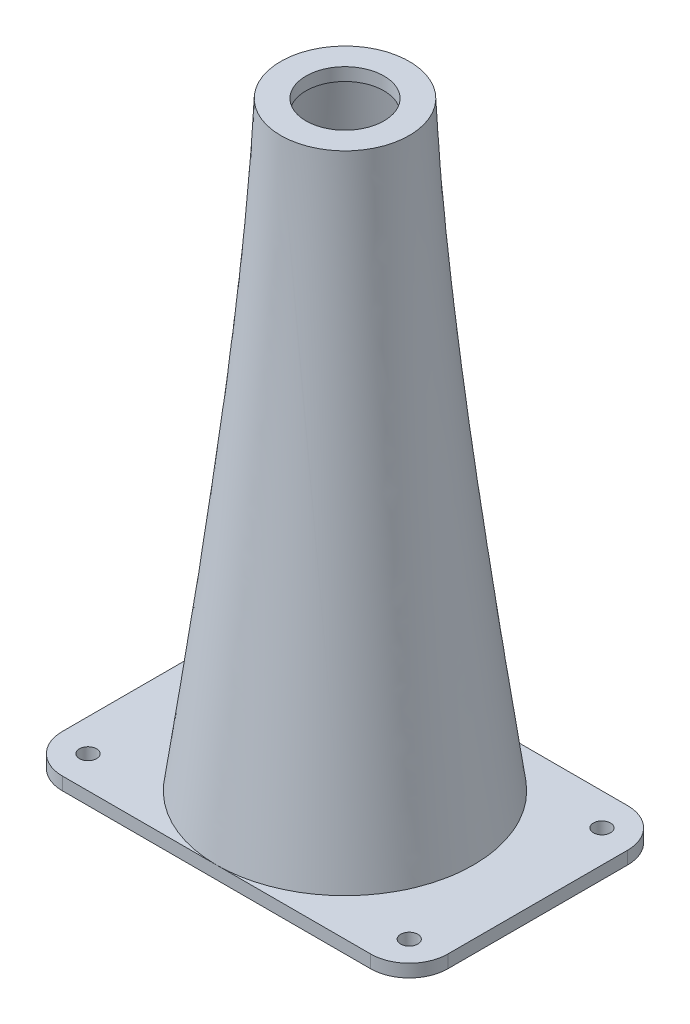
ISO-10303-21;
HEADER;
FILE_DESCRIPTION(('STEP AP214'),'2;1');
FILE_NAME('part.step','',(''),(''),'','','');
FILE_SCHEMA(('AUTOMOTIVE_DESIGN { 1 0 10303 214 1 1 1 1 }'));
ENDSEC;
DATA;
#1=APPLICATION_CONTEXT('core data for automotive mechanical design processes');
#2=APPLICATION_PROTOCOL_DEFINITION('international standard','automotive_design',2000,#1);
#3=PRODUCT_CONTEXT('',#1,'mechanical');
#4=PRODUCT('Part','Part','',(#3));
#5=PRODUCT_RELATED_PRODUCT_CATEGORY('part','',(#4));
#6=PRODUCT_DEFINITION_FORMATION('','',#4);
#7=PRODUCT_DEFINITION_CONTEXT('part definition',#1,'design');
#8=PRODUCT_DEFINITION('design','',#6,#7);
#9=PRODUCT_DEFINITION_SHAPE('','',#8);
#10=(LENGTH_UNIT() NAMED_UNIT(*) SI_UNIT(.MILLI.,.METRE.));
#11=(NAMED_UNIT(*) PLANE_ANGLE_UNIT() SI_UNIT($,.RADIAN.));
#12=(NAMED_UNIT(*) SI_UNIT($,.STERADIAN.) SOLID_ANGLE_UNIT());
#13=UNCERTAINTY_MEASURE_WITH_UNIT(LENGTH_MEASURE(1.E-05),#10,'distance_accuracy_value','');
#14=(GEOMETRIC_REPRESENTATION_CONTEXT(3) GLOBAL_UNCERTAINTY_ASSIGNED_CONTEXT((#13)) GLOBAL_UNIT_ASSIGNED_CONTEXT((#10,
#11,#12)) REPRESENTATION_CONTEXT('',''));
#15=CARTESIAN_POINT('',(0.,0.,0.));
#16=DIRECTION('',(0.,0.,1.));
#17=DIRECTION('',(1.,0.,0.));
#18=AXIS2_PLACEMENT_3D('',#15,#16,#17);
#19=CARTESIAN_POINT('',(0.,0.,0.));
#20=DIRECTION('',(0.,-1.,0.));
#21=DIRECTION('',(0.,0.,-1.));
#22=AXIS2_PLACEMENT_3D('',#19,#20,#21);
#23=CONICAL_SURFACE('',#22,27.5,0.10471975511966);
#24=CARTESIAN_POINT('',(0.,0.,0.));
#25=DIRECTION('',(0.,-1.,0.));
#26=DIRECTION('',(0.,0.,-1.));
#27=AXIS2_PLACEMENT_3D('',#24,#25,#26);
#28=CIRCLE('',#27,27.5);
#29=CARTESIAN_POINT('',(0.,0.,-27.5));
#30=VERTEX_POINT('',#29);
#31=EDGE_CURVE('E120',#30,#30,#28,.F.);
#32=ORIENTED_EDGE('',*,*,#31,.F.);
#33=EDGE_LOOP('',(#32));
#34=FACE_BOUND('',#33,.T.);
#35=CARTESIAN_POINT('',(0.,137.,0.));
#36=DIRECTION('',(0.,1.,0.));
#37=DIRECTION('',(0.,0.,1.));
#38=AXIS2_PLACEMENT_3D('',#35,#36,#37);
#39=CIRCLE('',#38,13.1007197686023);
#40=CARTESIAN_POINT('',(0.,137.,13.1007197686023));
#41=VERTEX_POINT('',#40);
#42=EDGE_CURVE('E141',#41,#41,#39,.F.);
#43=ORIENTED_EDGE('',*,*,#42,.F.);
#44=EDGE_LOOP('',(#43));
#45=FACE_BOUND('',#44,.T.);
#46=ADVANCED_FACE('F41',(#34,#45),#23,.F.);
#47=CARTESIAN_POINT('',(0.,140.,0.));
#48=DIRECTION('',(0.,1.,0.));
#49=DIRECTION('',(0.,0.,1.));
#50=AXIS2_PLACEMENT_3D('',#47,#48,#49);
#51=PLANE('',#50);
#52=CARTESIAN_POINT('',(0.,140.,0.));
#53=DIRECTION('',(0.,1.,0.));
#54=DIRECTION('',(0.,0.,1.));
#55=AXIS2_PLACEMENT_3D('',#52,#53,#54);
#56=CIRCLE('',#55,15.);
#57=CARTESIAN_POINT('',(0.,140.,15.));
#58=VERTEX_POINT('',#57);
#59=EDGE_CURVE('E131',#58,#58,#56,.T.);
#60=ORIENTED_EDGE('',*,*,#59,.T.);
#61=EDGE_LOOP('',(#60));
#62=FACE_BOUND('',#61,.T.);
#63=CARTESIAN_POINT('',(0.,140.,0.));
#64=DIRECTION('',(0.,1.,0.));
#65=DIRECTION('',(0.,0.,1.));
#66=AXIS2_PLACEMENT_3D('',#63,#64,#65);
#67=CIRCLE('',#66,9.1);
#68=CARTESIAN_POINT('',(0.,140.,9.1));
#69=VERTEX_POINT('',#68);
#70=EDGE_CURVE('E155',#69,#69,#67,.T.);
#71=ORIENTED_EDGE('',*,*,#70,.F.);
#72=EDGE_LOOP('',(#71));
#73=FACE_BOUND('',#72,.T.);
#74=ADVANCED_FACE('F240',(#62,#73),#51,.T.);
#75=CARTESIAN_POINT('',(10.752198870761,140.,10.4589779349422));
#76=CARTESIAN_POINT('',(29.9923257228319,0.,-0.678526149501881));
#77=CARTESIAN_POINT('',(-10.1657569991234,140.,31.9633756764641));
#78=CARTESIAN_POINT('',(31.3493780218356,0.,59.3061252961618));
#79=CARTESIAN_POINT('',(-31.6701547406453,140.,11.0454198065797));
#80=CARTESIAN_POINT('',(-28.6352734238281,0.,60.6631775951656));
#81=CARTESIAN_POINT('',(-10.7521988707609,140.,-10.4589779349422));
#82=CARTESIAN_POINT('',(-29.9923257228319,0.,0.678526149501877));
#83=CARTESIAN_POINT('',(10.1657569991234,140.,-31.9633756764641));
#84=CARTESIAN_POINT('',(-31.3493780218356,0.,-59.3061252961619));
#85=CARTESIAN_POINT('',(31.6701547406453,140.,-11.0454198065797));
#86=CARTESIAN_POINT('',(28.6352734238281,0.,-60.6631775951656));
#87=CARTESIAN_POINT('',(10.752198870761,140.,10.4589779349422));
#88=CARTESIAN_POINT('',(29.9923257228319,0.,-0.678526149501881));
#89=(BOUNDED_SURFACE() B_SPLINE_SURFACE(3,1,((#75,#76),(#77,#78),(#79,#80),(#81,#82),(#83,#84),
(#85,#86),(#87,#88)),.UNSPECIFIED.,.T.,.F.,.F.) B_SPLINE_SURFACE_WITH_KNOTS((4,3,4),(2,2),(0.,
0.5,1.),(0.,1.),.UNSPECIFIED.) GEOMETRIC_REPRESENTATION_ITEM() RATIONAL_B_SPLINE_SURFACE(((1.,
1.),(0.333333333333333,0.333333333333333),(0.333333333333333,0.333333333333333),(1.,1.),
(0.333333333333333,0.333333333333333),(0.333333333333333,0.333333333333333),(1.,1.))) REPRESENTATION_ITEM('') SURFACE());
#90=CARTESIAN_POINT('',(0.,0.,0.));
#91=DIRECTION('',(0.,1.,0.));
#92=DIRECTION('',(0.,0.,1.));
#93=AXIS2_PLACEMENT_3D('',#90,#91,#92);
#94=CIRCLE('',#93,30.);
#95=CARTESIAN_POINT('',(0.000549099686862685,0.,-30.0000000000041));
#96=VERTEX_POINT('',#95);
#97=CARTESIAN_POINT('',(0.,0.,30.));
#98=VERTEX_POINT('',#97);
#99=EDGE_CURVE('E116',#96,#98,#94,.T.);
#100=EDGE_CURVE('E126',#98,#96,#94,.T.);
#101=ORIENTED_EDGE('',*,*,#59,.F.);
#102=EDGE_LOOP('',(#101));
#103=FACE_BOUND('',#102,.T.);
#104=ORIENTED_EDGE('',*,*,#99,.T.);
#105=ORIENTED_EDGE('',*,*,#100,.T.);
#106=EDGE_LOOP('',(#104,#105));
#107=FACE_BOUND('',#106,.T.);
#108=ADVANCED_FACE('F140',(#103,#107),#89,.T.);
#109=CARTESIAN_POINT('',(0.,137.,0.));
#110=DIRECTION('',(0.,1.,0.));
#111=DIRECTION('',(0.,0.,1.));
#112=AXIS2_PLACEMENT_3D('',#109,#110,#111);
#113=PLANE('',#112);
#114=CARTESIAN_POINT('',(0.,137.,0.));
#115=DIRECTION('',(0.,1.,0.));
#116=DIRECTION('',(0.,0.,1.));
#117=AXIS2_PLACEMENT_3D('',#114,#115,#116);
#118=CIRCLE('',#117,9.1);
#119=CARTESIAN_POINT('',(0.,137.,9.1));
#120=VERTEX_POINT('',#119);
#121=EDGE_CURVE('E154',#120,#120,#118,.T.);
#122=ORIENTED_EDGE('',*,*,#121,.T.);
#123=EDGE_LOOP('',(#122));
#124=FACE_BOUND('',#123,.T.);
#125=ORIENTED_EDGE('',*,*,#42,.T.);
#126=EDGE_LOOP('',(#125));
#127=FACE_BOUND('',#126,.T.);
#128=ADVANCED_FACE('F252',(#124,#127),#113,.F.);
#129=CARTESIAN_POINT('',(0.,137.,0.));
#130=DIRECTION('',(0.,1.,0.));
#131=DIRECTION('',(0.,0.,1.));
#132=AXIS2_PLACEMENT_3D('',#129,#130,#131);
#133=CYLINDRICAL_SURFACE('',#132,9.1);
#134=ORIENTED_EDGE('',*,*,#121,.F.);
#135=EDGE_LOOP('',(#134));
#136=FACE_BOUND('',#135,.T.);
#137=ORIENTED_EDGE('',*,*,#70,.T.);
#138=EDGE_LOOP('',(#137));
#139=FACE_BOUND('',#138,.T.);
#140=ADVANCED_FACE('F269',(#136,#139),#133,.F.);
#141=CARTESIAN_POINT('',(0.,0.,0.));
#142=DIRECTION('',(0.,-1.,0.));
#143=DIRECTION('',(0.,0.,-1.));
#144=AXIS2_PLACEMENT_3D('',#141,#142,#143);
#145=PLANE('',#144);
#146=CARTESIAN_POINT('',(-37.5,0.,22.5));
#147=DIRECTION('',(0.,-1.,0.));
#148=DIRECTION('',(0.,0.,-1.));
#149=AXIS2_PLACEMENT_3D('',#146,#147,#148);
#150=CIRCLE('',#149,2.);
#151=CARTESIAN_POINT('',(-37.5,0.,20.5));
#152=VERTEX_POINT('',#151);
#153=EDGE_CURVE('E478',#152,#152,#150,.F.);
#154=ORIENTED_EDGE('',*,*,#153,.F.);
#155=EDGE_LOOP('',(#154));
#156=FACE_BOUND('',#155,.T.);
#157=CARTESIAN_POINT('',(-37.5,0.,-22.5));
#158=DIRECTION('',(0.,-1.,0.));
#159=DIRECTION('',(0.,0.,-1.));
#160=AXIS2_PLACEMENT_3D('',#157,#158,#159);
#161=CIRCLE('',#160,2.);
#162=CARTESIAN_POINT('',(-37.5,0.,-24.5));
#163=VERTEX_POINT('',#162);
#164=EDGE_CURVE('E481',#163,#163,#161,.T.);
#165=ORIENTED_EDGE('',*,*,#164,.T.);
#166=EDGE_LOOP('',(#165));
#167=FACE_BOUND('',#166,.T.);
#168=DIRECTION('',(1.,0.,0.));
#169=VECTOR('',#168,1.);
#170=CARTESIAN_POINT('',(0.,0.,-30.));
#171=LINE('',#170,#169);
#172=CARTESIAN_POINT('',(-36.,0.,-30.));
#173=VERTEX_POINT('',#172);
#174=EDGE_CURVE('E162',#173,#96,#171,.T.);
#175=ORIENTED_EDGE('',*,*,#174,.F.);
#176=CARTESIAN_POINT('',(-36.,0.,-21.));
#177=DIRECTION('',(0.,-1.,0.));
#178=DIRECTION('',(0.,0.,-1.));
#179=AXIS2_PLACEMENT_3D('',#176,#177,#178);
#180=CIRCLE('',#179,9.);
#181=CARTESIAN_POINT('',(-45.,0.,-21.));
#182=VERTEX_POINT('',#181);
#183=EDGE_CURVE('E64',#173,#182,#180,.F.);
#184=ORIENTED_EDGE('',*,*,#183,.T.);
#185=DIRECTION('',(0.,0.,1.));
#186=VECTOR('',#185,1.);
#187=CARTESIAN_POINT('',(-45.,0.,0.));
#188=LINE('',#187,#186);
#189=CARTESIAN_POINT('',(-45.,0.,21.));
#190=VERTEX_POINT('',#189);
#191=EDGE_CURVE('E163',#182,#190,#188,.T.);
#192=ORIENTED_EDGE('',*,*,#191,.T.);
#193=CARTESIAN_POINT('',(-36.,0.,21.));
#194=DIRECTION('',(0.,-1.,0.));
#195=DIRECTION('',(0.,0.,-1.));
#196=AXIS2_PLACEMENT_3D('',#193,#194,#195);
#197=CIRCLE('',#196,9.);
#198=CARTESIAN_POINT('',(-36.,0.,30.));
#199=VERTEX_POINT('',#198);
#200=EDGE_CURVE('E56',#190,#199,#197,.F.);
#201=ORIENTED_EDGE('',*,*,#200,.T.);
#202=DIRECTION('',(1.,0.,0.));
#203=VECTOR('',#202,1.);
#204=CARTESIAN_POINT('',(0.,0.,30.));
#205=LINE('',#204,#203);
#206=EDGE_CURVE('E112',#199,#98,#205,.T.);
#207=ORIENTED_EDGE('',*,*,#206,.T.);
#208=ORIENTED_EDGE('',*,*,#99,.F.);
#209=EDGE_LOOP('',(#175,#184,#192,#201,#207,#208));
#210=FACE_BOUND('',#209,.T.);
#211=ADVANCED_FACE('F114',(#156,#167,#210),#145,.F.);
#212=CARTESIAN_POINT('',(37.5,0.,22.5));
#213=DIRECTION('',(0.,-1.,0.));
#214=DIRECTION('',(0.,0.,-1.));
#215=AXIS2_PLACEMENT_3D('',#212,#213,#214);
#216=CIRCLE('',#215,2.);
#217=CARTESIAN_POINT('',(37.5,0.,20.5));
#218=VERTEX_POINT('',#217);
#219=EDGE_CURVE('E473',#218,#218,#216,.T.);
#220=ORIENTED_EDGE('',*,*,#219,.T.);
#221=EDGE_LOOP('',(#220));
#222=FACE_BOUND('',#221,.T.);
#223=CARTESIAN_POINT('',(37.5,0.,-22.5));
#224=DIRECTION('',(0.,-1.,0.));
#225=DIRECTION('',(0.,0.,-1.));
#226=AXIS2_PLACEMENT_3D('',#223,#224,#225);
#227=CIRCLE('',#226,2.);
#228=CARTESIAN_POINT('',(37.5,0.,-24.5));
#229=VERTEX_POINT('',#228);
#230=EDGE_CURVE('E476',#229,#229,#227,.F.);
#231=ORIENTED_EDGE('',*,*,#230,.F.);
#232=EDGE_LOOP('',(#231));
#233=FACE_BOUND('',#232,.T.);
#234=CARTESIAN_POINT('',(36.,0.,30.));
#235=VERTEX_POINT('',#234);
#236=EDGE_CURVE('E121',#98,#235,#205,.T.);
#237=ORIENTED_EDGE('',*,*,#236,.T.);
#238=CARTESIAN_POINT('',(36.,0.,21.));
#239=DIRECTION('',(0.,-1.,0.));
#240=DIRECTION('',(0.,0.,-1.));
#241=AXIS2_PLACEMENT_3D('',#238,#239,#240);
#242=CIRCLE('',#241,9.);
#243=CARTESIAN_POINT('',(45.,0.,21.));
#244=VERTEX_POINT('',#243);
#245=EDGE_CURVE('E213',#235,#244,#242,.F.);
#246=ORIENTED_EDGE('',*,*,#245,.T.);
#247=DIRECTION('',(0.,0.,1.));
#248=VECTOR('',#247,1.);
#249=CARTESIAN_POINT('',(45.,0.,0.));
#250=LINE('',#249,#248);
#251=CARTESIAN_POINT('',(45.,0.,-21.));
#252=VERTEX_POINT('',#251);
#253=EDGE_CURVE('E138',#252,#244,#250,.T.);
#254=ORIENTED_EDGE('',*,*,#253,.F.);
#255=CARTESIAN_POINT('',(36.,0.,-21.));
#256=DIRECTION('',(0.,-1.,0.));
#257=DIRECTION('',(0.,0.,-1.));
#258=AXIS2_PLACEMENT_3D('',#255,#256,#257);
#259=CIRCLE('',#258,9.);
#260=CARTESIAN_POINT('',(36.,0.,-30.));
#261=VERTEX_POINT('',#260);
#262=EDGE_CURVE('E214',#252,#261,#259,.F.);
#263=ORIENTED_EDGE('',*,*,#262,.T.);
#264=EDGE_CURVE('E129',#96,#261,#171,.T.);
#265=ORIENTED_EDGE('',*,*,#264,.F.);
#266=ORIENTED_EDGE('',*,*,#100,.F.);
#267=EDGE_LOOP('',(#237,#246,#254,#263,#265,#266));
#268=FACE_BOUND('',#267,.T.);
#269=ADVANCED_FACE('F127',(#222,#233,#268),#145,.F.);
#270=CARTESIAN_POINT('',(-45.,-3.,0.));
#271=DIRECTION('',(-1.,0.,0.));
#272=DIRECTION('',(0.,0.,1.));
#273=AXIS2_PLACEMENT_3D('',#270,#271,#272);
#274=PLANE('',#273);
#275=ORIENTED_EDGE('',*,*,#191,.F.);
#276=DIRECTION('',(0.,1.,0.));
#277=VECTOR('',#276,1.);
#278=CARTESIAN_POINT('',(-45.,-3.,-21.));
#279=LINE('',#278,#277);
#280=CARTESIAN_POINT('',(-45.,-3.,-21.));
#281=VERTEX_POINT('',#280);
#282=EDGE_CURVE('E12',#182,#281,#279,.F.);
#283=ORIENTED_EDGE('',*,*,#282,.T.);
#284=DIRECTION('',(0.,0.,1.));
#285=VECTOR('',#284,1.);
#286=CARTESIAN_POINT('',(-45.,-3.,0.));
#287=LINE('',#286,#285);
#288=CARTESIAN_POINT('',(-45.,-3.,21.));
#289=VERTEX_POINT('',#288);
#290=EDGE_CURVE('E186',#281,#289,#287,.T.);
#291=ORIENTED_EDGE('',*,*,#290,.T.);
#292=DIRECTION('',(0.,1.,0.));
#293=VECTOR('',#292,1.);
#294=CARTESIAN_POINT('',(-45.,-3.,21.));
#295=LINE('',#294,#293);
#296=EDGE_CURVE('E49',#289,#190,#295,.T.);
#297=ORIENTED_EDGE('',*,*,#296,.T.);
#298=EDGE_LOOP('',(#275,#283,#291,#297));
#299=FACE_BOUND('',#298,.T.);
#300=ADVANCED_FACE('F183',(#299),#274,.T.);
#301=CARTESIAN_POINT('',(0.,-3.,-30.));
#302=DIRECTION('',(0.,0.,1.));
#303=DIRECTION('',(1.,0.,0.));
#304=AXIS2_PLACEMENT_3D('',#301,#302,#303);
#305=PLANE('',#304);
#306=ORIENTED_EDGE('',*,*,#264,.T.);
#307=DIRECTION('',(0.,1.,0.));
#308=VECTOR('',#307,1.);
#309=CARTESIAN_POINT('',(36.,-3.,-30.));
#310=LINE('',#309,#308);
#311=CARTESIAN_POINT('',(36.,-3.,-30.));
#312=VERTEX_POINT('',#311);
#313=EDGE_CURVE('E178',#261,#312,#310,.F.);
#314=ORIENTED_EDGE('',*,*,#313,.T.);
#315=DIRECTION('',(1.,0.,0.));
#316=VECTOR('',#315,1.);
#317=CARTESIAN_POINT('',(0.,-3.,-30.));
#318=LINE('',#317,#316);
#319=CARTESIAN_POINT('',(-36.,-3.,-30.));
#320=VERTEX_POINT('',#319);
#321=EDGE_CURVE('E495',#320,#312,#318,.T.);
#322=ORIENTED_EDGE('',*,*,#321,.F.);
#323=DIRECTION('',(0.,1.,0.));
#324=VECTOR('',#323,1.);
#325=CARTESIAN_POINT('',(-36.,0.,-30.));
#326=LINE('',#325,#324);
#327=EDGE_CURVE('E175',#320,#173,#326,.T.);
#328=ORIENTED_EDGE('',*,*,#327,.T.);
#329=ORIENTED_EDGE('',*,*,#174,.T.);
#330=EDGE_LOOP('',(#306,#314,#322,#328,#329));
#331=FACE_BOUND('',#330,.T.);
#332=ADVANCED_FACE('F227',(#331),#305,.F.);
#333=CARTESIAN_POINT('',(45.,-3.,0.));
#334=DIRECTION('',(-1.,0.,0.));
#335=DIRECTION('',(0.,0.,1.));
#336=AXIS2_PLACEMENT_3D('',#333,#334,#335);
#337=PLANE('',#336);
#338=ORIENTED_EDGE('',*,*,#253,.T.);
#339=DIRECTION('',(0.,1.,0.));
#340=VECTOR('',#339,1.);
#341=CARTESIAN_POINT('',(45.,-3.,21.));
#342=LINE('',#341,#340);
#343=CARTESIAN_POINT('',(45.,-3.,21.));
#344=VERTEX_POINT('',#343);
#345=EDGE_CURVE('E192',#244,#344,#342,.F.);
#346=ORIENTED_EDGE('',*,*,#345,.T.);
#347=DIRECTION('',(0.,0.,1.));
#348=VECTOR('',#347,1.);
#349=CARTESIAN_POINT('',(45.,-3.,0.));
#350=LINE('',#349,#348);
#351=CARTESIAN_POINT('',(45.,-3.,-21.));
#352=VERTEX_POINT('',#351);
#353=EDGE_CURVE('E207',#352,#344,#350,.T.);
#354=ORIENTED_EDGE('',*,*,#353,.F.);
#355=DIRECTION('',(0.,1.,0.));
#356=VECTOR('',#355,1.);
#357=CARTESIAN_POINT('',(45.,-3.,-21.));
#358=LINE('',#357,#356);
#359=EDGE_CURVE('E196',#352,#252,#358,.T.);
#360=ORIENTED_EDGE('',*,*,#359,.T.);
#361=EDGE_LOOP('',(#338,#346,#354,#360));
#362=FACE_BOUND('',#361,.T.);
#363=ADVANCED_FACE('F223',(#362),#337,.F.);
#364=CARTESIAN_POINT('',(37.5,-3.,-22.5));
#365=DIRECTION('',(0.,1.,0.));
#366=DIRECTION('',(0.,0.,1.));
#367=AXIS2_PLACEMENT_3D('',#364,#365,#366);
#368=CYLINDRICAL_SURFACE('',#367,2.);
#369=CARTESIAN_POINT('',(37.5,-3.,-22.5));
#370=DIRECTION('',(0.,-1.,0.));
#371=DIRECTION('',(0.,0.,-1.));
#372=AXIS2_PLACEMENT_3D('',#369,#370,#371);
#373=CIRCLE('',#372,2.);
#374=CARTESIAN_POINT('',(37.5,-3.,-24.5));
#375=VERTEX_POINT('',#374);
#376=EDGE_CURVE('E508',#375,#375,#373,.F.);
#377=ORIENTED_EDGE('',*,*,#376,.F.);
#378=EDGE_LOOP('',(#377));
#379=FACE_BOUND('',#378,.T.);
#380=ORIENTED_EDGE('',*,*,#230,.T.);
#381=EDGE_LOOP('',(#380));
#382=FACE_BOUND('',#381,.T.);
#383=ADVANCED_FACE('F289',(#379,#382),#368,.F.);
#384=CARTESIAN_POINT('',(-37.5,-3.,22.5));
#385=DIRECTION('',(0.,1.,0.));
#386=DIRECTION('',(0.,0.,1.));
#387=AXIS2_PLACEMENT_3D('',#384,#385,#386);
#388=CYLINDRICAL_SURFACE('',#387,2.);
#389=CARTESIAN_POINT('',(-37.5,-3.,22.5));
#390=DIRECTION('',(0.,-1.,0.));
#391=DIRECTION('',(0.,0.,-1.));
#392=AXIS2_PLACEMENT_3D('',#389,#390,#391);
#393=CIRCLE('',#392,2.);
#394=CARTESIAN_POINT('',(-37.5,-3.,20.5));
#395=VERTEX_POINT('',#394);
#396=EDGE_CURVE('E505',#395,#395,#393,.F.);
#397=ORIENTED_EDGE('',*,*,#396,.F.);
#398=EDGE_LOOP('',(#397));
#399=FACE_BOUND('',#398,.T.);
#400=ORIENTED_EDGE('',*,*,#153,.T.);
#401=EDGE_LOOP('',(#400));
#402=FACE_BOUND('',#401,.T.);
#403=ADVANCED_FACE('F300',(#399,#402),#388,.F.);
#404=CARTESIAN_POINT('',(-37.5,-3.,-22.5));
#405=DIRECTION('',(0.,1.,0.));
#406=DIRECTION('',(0.,0.,1.));
#407=AXIS2_PLACEMENT_3D('',#404,#405,#406);
#408=CYLINDRICAL_SURFACE('',#407,2.);
#409=CARTESIAN_POINT('',(-37.5,-3.,-22.5));
#410=DIRECTION('',(0.,-1.,0.));
#411=DIRECTION('',(0.,0.,-1.));
#412=AXIS2_PLACEMENT_3D('',#409,#410,#411);
#413=CIRCLE('',#412,2.);
#414=CARTESIAN_POINT('',(-37.5,-3.,-24.5));
#415=VERTEX_POINT('',#414);
#416=EDGE_CURVE('E502',#415,#415,#413,.T.);
#417=ORIENTED_EDGE('',*,*,#416,.T.);
#418=EDGE_LOOP('',(#417));
#419=FACE_BOUND('',#418,.T.);
#420=ORIENTED_EDGE('',*,*,#164,.F.);
#421=EDGE_LOOP('',(#420));
#422=FACE_BOUND('',#421,.T.);
#423=ADVANCED_FACE('F296',(#419,#422),#408,.F.);
#424=CARTESIAN_POINT('',(0.,-3.,0.));
#425=DIRECTION('',(0.,1.,0.));
#426=DIRECTION('',(0.,0.,1.));
#427=AXIS2_PLACEMENT_3D('',#424,#425,#426);
#428=CYLINDRICAL_SURFACE('',#427,27.5);
#429=CARTESIAN_POINT('',(0.,-3.,0.));
#430=DIRECTION('',(0.,-1.,0.));
#431=DIRECTION('',(0.,0.,-1.));
#432=AXIS2_PLACEMENT_3D('',#429,#430,#431);
#433=CIRCLE('',#432,27.5);
#434=CARTESIAN_POINT('',(0.,-3.,-27.5));
#435=VERTEX_POINT('',#434);
#436=EDGE_CURVE('E210',#435,#435,#433,.F.);
#437=ORIENTED_EDGE('',*,*,#436,.F.);
#438=EDGE_LOOP('',(#437));
#439=FACE_BOUND('',#438,.T.);
#440=ORIENTED_EDGE('',*,*,#31,.T.);
#441=EDGE_LOOP('',(#440));
#442=FACE_BOUND('',#441,.T.);
#443=ADVANCED_FACE('F293',(#439,#442),#428,.F.);
#444=CARTESIAN_POINT('',(0.,-3.,30.));
#445=DIRECTION('',(0.,0.,1.));
#446=DIRECTION('',(1.,0.,0.));
#447=AXIS2_PLACEMENT_3D('',#444,#445,#446);
#448=PLANE('',#447);
#449=DIRECTION('',(1.,0.,0.));
#450=VECTOR('',#449,1.);
#451=CARTESIAN_POINT('',(0.,-3.,30.));
#452=LINE('',#451,#450);
#453=CARTESIAN_POINT('',(-36.,-3.,30.));
#454=VERTEX_POINT('',#453);
#455=CARTESIAN_POINT('',(36.,-3.,30.));
#456=VERTEX_POINT('',#455);
#457=EDGE_CURVE('E206',#454,#456,#452,.T.);
#458=ORIENTED_EDGE('',*,*,#457,.T.);
#459=DIRECTION('',(0.,1.,0.));
#460=VECTOR('',#459,1.);
#461=CARTESIAN_POINT('',(36.,0.,30.));
#462=LINE('',#461,#460);
#463=EDGE_CURVE('E137',#456,#235,#462,.T.);
#464=ORIENTED_EDGE('',*,*,#463,.T.);
#465=ORIENTED_EDGE('',*,*,#236,.F.);
#466=ORIENTED_EDGE('',*,*,#206,.F.);
#467=DIRECTION('',(0.,1.,0.));
#468=VECTOR('',#467,1.);
#469=CARTESIAN_POINT('',(-36.,-3.,30.));
#470=LINE('',#469,#468);
#471=EDGE_CURVE('E144',#199,#454,#470,.F.);
#472=ORIENTED_EDGE('',*,*,#471,.T.);
#473=EDGE_LOOP('',(#458,#464,#465,#466,#472));
#474=FACE_BOUND('',#473,.T.);
#475=ADVANCED_FACE('F135',(#474),#448,.T.);
#476=CARTESIAN_POINT('',(37.5,-3.,22.5));
#477=DIRECTION('',(0.,1.,0.));
#478=DIRECTION('',(0.,0.,1.));
#479=AXIS2_PLACEMENT_3D('',#476,#477,#478);
#480=CYLINDRICAL_SURFACE('',#479,2.);
#481=CARTESIAN_POINT('',(37.5,-3.,22.5));
#482=DIRECTION('',(0.,-1.,0.));
#483=DIRECTION('',(0.,0.,-1.));
#484=AXIS2_PLACEMENT_3D('',#481,#482,#483);
#485=CIRCLE('',#484,2.);
#486=CARTESIAN_POINT('',(37.5,-3.,20.5));
#487=VERTEX_POINT('',#486);
#488=EDGE_CURVE('E158',#487,#487,#485,.T.);
#489=ORIENTED_EDGE('',*,*,#488,.T.);
#490=EDGE_LOOP('',(#489));
#491=FACE_BOUND('',#490,.T.);
#492=ORIENTED_EDGE('',*,*,#219,.F.);
#493=EDGE_LOOP('',(#492));
#494=FACE_BOUND('',#493,.T.);
#495=ADVANCED_FACE('F292',(#491,#494),#480,.F.);
#496=CARTESIAN_POINT('',(0.,-3.,0.));
#497=DIRECTION('',(0.,-1.,0.));
#498=DIRECTION('',(0.,0.,-1.));
#499=AXIS2_PLACEMENT_3D('',#496,#497,#498);
#500=PLANE('',#499);
#501=ORIENTED_EDGE('',*,*,#353,.T.);
#502=CARTESIAN_POINT('',(36.,-3.,21.));
#503=DIRECTION('',(0.,-1.,0.));
#504=DIRECTION('',(0.,0.,-1.));
#505=AXIS2_PLACEMENT_3D('',#502,#503,#504);
#506=CIRCLE('',#505,9.);
#507=EDGE_CURVE('E173',#344,#456,#506,.T.);
#508=ORIENTED_EDGE('',*,*,#507,.T.);
#509=ORIENTED_EDGE('',*,*,#457,.F.);
#510=CARTESIAN_POINT('',(-36.,-3.,21.));
#511=DIRECTION('',(0.,-1.,0.));
#512=DIRECTION('',(0.,0.,-1.));
#513=AXIS2_PLACEMENT_3D('',#510,#511,#512);
#514=CIRCLE('',#513,9.);
#515=EDGE_CURVE('E188',#454,#289,#514,.T.);
#516=ORIENTED_EDGE('',*,*,#515,.T.);
#517=ORIENTED_EDGE('',*,*,#290,.F.);
#518=CARTESIAN_POINT('',(-36.,-3.,-21.));
#519=DIRECTION('',(0.,-1.,0.));
#520=DIRECTION('',(0.,0.,-1.));
#521=AXIS2_PLACEMENT_3D('',#518,#519,#520);
#522=CIRCLE('',#521,9.);
#523=EDGE_CURVE('E191',#281,#320,#522,.T.);
#524=ORIENTED_EDGE('',*,*,#523,.T.);
#525=ORIENTED_EDGE('',*,*,#321,.T.);
#526=CARTESIAN_POINT('',(36.,-3.,-21.));
#527=DIRECTION('',(0.,-1.,0.));
#528=DIRECTION('',(0.,0.,-1.));
#529=AXIS2_PLACEMENT_3D('',#526,#527,#528);
#530=CIRCLE('',#529,9.);
#531=EDGE_CURVE('E194',#312,#352,#530,.T.);
#532=ORIENTED_EDGE('',*,*,#531,.T.);
#533=EDGE_LOOP('',(#501,#508,#509,#516,#517,#524,#525,#532));
#534=FACE_BOUND('',#533,.T.);
#535=ORIENTED_EDGE('',*,*,#436,.T.);
#536=EDGE_LOOP('',(#535));
#537=FACE_BOUND('',#536,.T.);
#538=ORIENTED_EDGE('',*,*,#416,.F.);
#539=EDGE_LOOP('',(#538));
#540=FACE_BOUND('',#539,.T.);
#541=ORIENTED_EDGE('',*,*,#396,.T.);
#542=EDGE_LOOP('',(#541));
#543=FACE_BOUND('',#542,.T.);
#544=ORIENTED_EDGE('',*,*,#376,.T.);
#545=EDGE_LOOP('',(#544));
#546=FACE_BOUND('',#545,.T.);
#547=ORIENTED_EDGE('',*,*,#488,.F.);
#548=EDGE_LOOP('',(#547));
#549=FACE_BOUND('',#548,.T.);
#550=ADVANCED_FACE('F204',(#534,#537,#540,#543,#546,#549),#500,.T.);
#551=CARTESIAN_POINT('',(36.,-3.,21.));
#552=DIRECTION('',(0.,-1.,0.));
#553=DIRECTION('',(0.,0.,-1.));
#554=AXIS2_PLACEMENT_3D('',#551,#552,#553);
#555=CYLINDRICAL_SURFACE('',#554,9.);
#556=ORIENTED_EDGE('',*,*,#507,.F.);
#557=ORIENTED_EDGE('',*,*,#345,.F.);
#558=ORIENTED_EDGE('',*,*,#245,.F.);
#559=ORIENTED_EDGE('',*,*,#463,.F.);
#560=EDGE_LOOP('',(#556,#557,#558,#559));
#561=FACE_BOUND('',#560,.T.);
#562=ADVANCED_FACE('F212',(#561),#555,.T.);
#563=CARTESIAN_POINT('',(36.,-3.,-21.));
#564=DIRECTION('',(0.,1.,0.));
#565=DIRECTION('',(0.,0.,1.));
#566=AXIS2_PLACEMENT_3D('',#563,#564,#565);
#567=CYLINDRICAL_SURFACE('',#566,9.);
#568=ORIENTED_EDGE('',*,*,#531,.F.);
#569=ORIENTED_EDGE('',*,*,#313,.F.);
#570=ORIENTED_EDGE('',*,*,#262,.F.);
#571=ORIENTED_EDGE('',*,*,#359,.F.);
#572=EDGE_LOOP('',(#568,#569,#570,#571));
#573=FACE_BOUND('',#572,.T.);
#574=ADVANCED_FACE('F229',(#573),#567,.T.);
#575=CARTESIAN_POINT('',(-36.,-3.,-21.));
#576=DIRECTION('',(0.,-1.,0.));
#577=DIRECTION('',(0.,0.,-1.));
#578=AXIS2_PLACEMENT_3D('',#575,#576,#577);
#579=CYLINDRICAL_SURFACE('',#578,9.);
#580=ORIENTED_EDGE('',*,*,#523,.F.);
#581=ORIENTED_EDGE('',*,*,#282,.F.);
#582=ORIENTED_EDGE('',*,*,#183,.F.);
#583=ORIENTED_EDGE('',*,*,#327,.F.);
#584=EDGE_LOOP('',(#580,#581,#582,#583));
#585=FACE_BOUND('',#584,.T.);
#586=ADVANCED_FACE('F231',(#585),#579,.T.);
#587=CARTESIAN_POINT('',(-36.,-3.,21.));
#588=DIRECTION('',(0.,1.,0.));
#589=DIRECTION('',(0.,0.,1.));
#590=AXIS2_PLACEMENT_3D('',#587,#588,#589);
#591=CYLINDRICAL_SURFACE('',#590,9.);
#592=ORIENTED_EDGE('',*,*,#515,.F.);
#593=ORIENTED_EDGE('',*,*,#471,.F.);
#594=ORIENTED_EDGE('',*,*,#200,.F.);
#595=ORIENTED_EDGE('',*,*,#296,.F.);
#596=EDGE_LOOP('',(#592,#593,#594,#595));
#597=FACE_BOUND('',#596,.T.);
#598=ADVANCED_FACE('F43',(#597),#591,.T.);
#599=CLOSED_SHELL('',(#46,#74,#108,#128,#140,#211,#269,#300,#332,#363,#383,#403,#423,#443,#475,
#495,#550,#562,#574,#586,#598));
#600=MANIFOLD_SOLID_BREP('B2',#599);
#601=ADVANCED_BREP_SHAPE_REPRESENTATION('',(#18,#600),#14);
#602=SHAPE_DEFINITION_REPRESENTATION(#9,#601);
ENDSEC;
END-ISO-10303-21;
